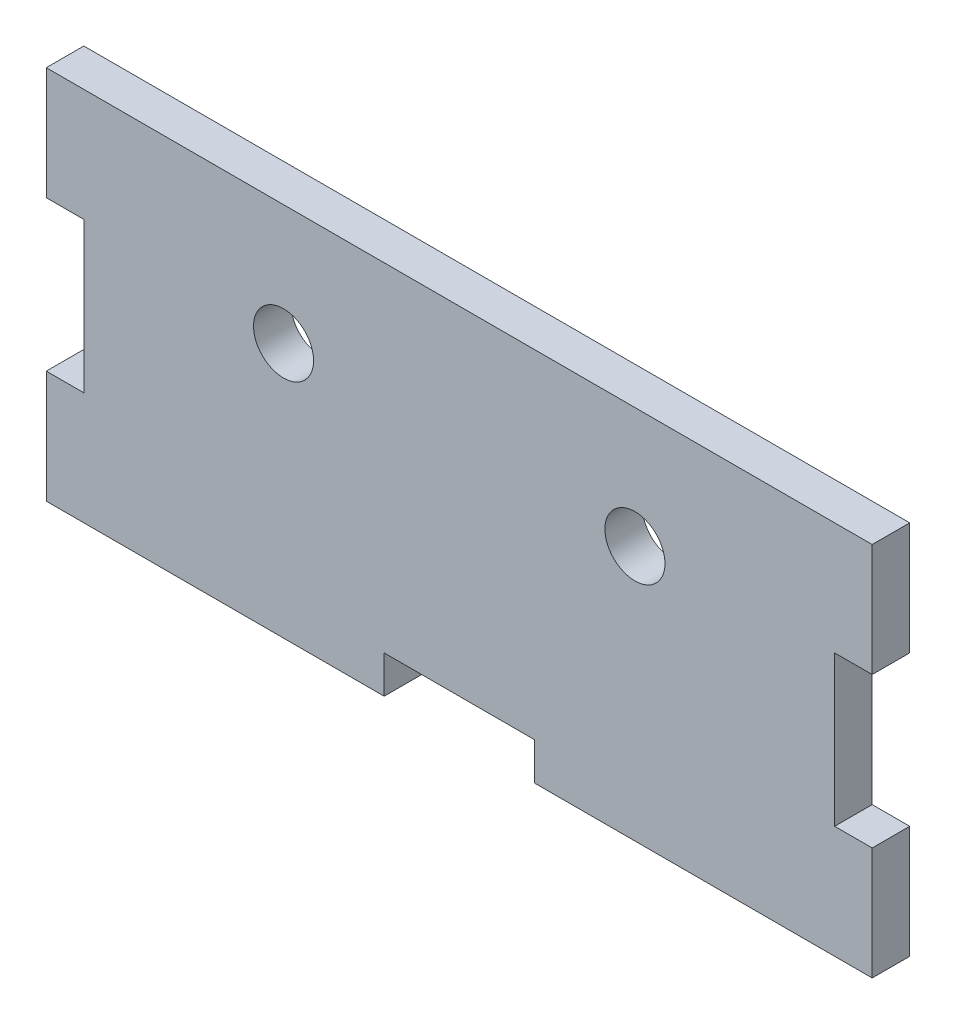
ISO-10303-21;
HEADER;
FILE_DESCRIPTION(('STEP AP214'),'2;1');
FILE_NAME('part.step','',(''),(''),'','','');
FILE_SCHEMA(('AUTOMOTIVE_DESIGN { 1 0 10303 214 1 1 1 1 }'));
ENDSEC;
DATA;
#1=APPLICATION_CONTEXT('core data for automotive mechanical design processes');
#2=APPLICATION_PROTOCOL_DEFINITION('international standard','automotive_design',2000,#1);
#3=PRODUCT_CONTEXT('',#1,'mechanical');
#4=PRODUCT('Part','Part','',(#3));
#5=PRODUCT_RELATED_PRODUCT_CATEGORY('part','',(#4));
#6=PRODUCT_DEFINITION_FORMATION('','',#4);
#7=PRODUCT_DEFINITION_CONTEXT('part definition',#1,'design');
#8=PRODUCT_DEFINITION('design','',#6,#7);
#9=PRODUCT_DEFINITION_SHAPE('','',#8);
#10=(LENGTH_UNIT() NAMED_UNIT(*) SI_UNIT(.MILLI.,.METRE.));
#11=(NAMED_UNIT(*) PLANE_ANGLE_UNIT() SI_UNIT($,.RADIAN.));
#12=(NAMED_UNIT(*) SI_UNIT($,.STERADIAN.) SOLID_ANGLE_UNIT());
#13=UNCERTAINTY_MEASURE_WITH_UNIT(LENGTH_MEASURE(1.E-05),#10,'distance_accuracy_value','');
#14=(GEOMETRIC_REPRESENTATION_CONTEXT(3) GLOBAL_UNCERTAINTY_ASSIGNED_CONTEXT((#13)) GLOBAL_UNIT_ASSIGNED_CONTEXT((#10,
#11,#12)) REPRESENTATION_CONTEXT('',''));
#15=CARTESIAN_POINT('',(0.,0.,0.));
#16=DIRECTION('',(0.,0.,1.));
#17=DIRECTION('',(1.,0.,0.));
#18=AXIS2_PLACEMENT_3D('',#15,#16,#17);
#19=CARTESIAN_POINT('',(0.,22.225,3.175));
#20=DIRECTION('',(0.,-1.,0.));
#21=DIRECTION('',(0.,0.,-1.));
#22=AXIS2_PLACEMENT_3D('',#19,#20,#21);
#23=PLANE('',#22);
#24=DIRECTION('',(-1.,0.,0.));
#25=VECTOR('',#24,1.);
#26=CARTESIAN_POINT('',(0.,22.225,0.));
#27=LINE('',#26,#25);
#28=CARTESIAN_POINT('',(69.85,22.225,0.));
#29=VERTEX_POINT('',#28);
#30=CARTESIAN_POINT('',(66.675,22.225,0.));
#31=VERTEX_POINT('',#30);
#32=EDGE_CURVE('E238',#29,#31,#27,.T.);
#33=ORIENTED_EDGE('',*,*,#32,.F.);
#34=DIRECTION('',(0.,0.,-1.));
#35=VECTOR('',#34,1.);
#36=CARTESIAN_POINT('',(69.85,22.225,3.175));
#37=LINE('',#36,#35);
#38=CARTESIAN_POINT('',(69.85,22.225,3.175));
#39=VERTEX_POINT('',#38);
#40=EDGE_CURVE('E11',#39,#29,#37,.T.);
#41=ORIENTED_EDGE('',*,*,#40,.F.);
#42=DIRECTION('',(-1.,0.,0.));
#43=VECTOR('',#42,1.);
#44=CARTESIAN_POINT('',(0.,22.225,3.175));
#45=LINE('',#44,#43);
#46=CARTESIAN_POINT('',(66.675,22.225,3.175));
#47=VERTEX_POINT('',#46);
#48=EDGE_CURVE('E499',#39,#47,#45,.T.);
#49=ORIENTED_EDGE('',*,*,#48,.T.);
#50=DIRECTION('',(0.,0.,-1.));
#51=VECTOR('',#50,1.);
#52=CARTESIAN_POINT('',(66.675,22.225,3.175));
#53=LINE('',#52,#51);
#54=EDGE_CURVE('E57',#47,#31,#53,.T.);
#55=ORIENTED_EDGE('',*,*,#54,.T.);
#56=EDGE_LOOP('',(#33,#41,#49,#55));
#57=FACE_BOUND('',#56,.T.);
#58=ADVANCED_FACE('F39',(#57),#23,.T.);
#59=CARTESIAN_POINT('',(69.85,0.,3.175));
#60=DIRECTION('',(-1.,0.,0.));
#61=DIRECTION('',(0.,0.,1.));
#62=AXIS2_PLACEMENT_3D('',#59,#60,#61);
#63=PLANE('',#62);
#64=DIRECTION('',(0.,1.,0.));
#65=VECTOR('',#64,1.);
#66=CARTESIAN_POINT('',(69.85,0.,0.));
#67=LINE('',#66,#65);
#68=CARTESIAN_POINT('',(69.85,31.75,0.));
#69=VERTEX_POINT('',#68);
#70=EDGE_CURVE('E234',#29,#69,#67,.T.);
#71=ORIENTED_EDGE('',*,*,#70,.T.);
#72=DIRECTION('',(0.,0.,-1.));
#73=VECTOR('',#72,1.);
#74=CARTESIAN_POINT('',(69.85,31.75,3.175));
#75=LINE('',#74,#73);
#76=CARTESIAN_POINT('',(69.85,31.75,3.175));
#77=VERTEX_POINT('',#76);
#78=EDGE_CURVE('E49',#77,#69,#75,.T.);
#79=ORIENTED_EDGE('',*,*,#78,.F.);
#80=DIRECTION('',(0.,1.,0.));
#81=VECTOR('',#80,1.);
#82=CARTESIAN_POINT('',(69.85,0.,3.175));
#83=LINE('',#82,#81);
#84=EDGE_CURVE('E177',#39,#77,#83,.T.);
#85=ORIENTED_EDGE('',*,*,#84,.F.);
#86=ORIENTED_EDGE('',*,*,#40,.T.);
#87=EDGE_LOOP('',(#71,#79,#85,#86));
#88=FACE_BOUND('',#87,.T.);
#89=ADVANCED_FACE('F235',(#88),#63,.F.);
#90=CARTESIAN_POINT('',(0.,31.75,3.175));
#91=DIRECTION('',(0.,1.,0.));
#92=DIRECTION('',(0.,0.,1.));
#93=AXIS2_PLACEMENT_3D('',#90,#91,#92);
#94=PLANE('',#93);
#95=DIRECTION('',(1.,0.,0.));
#96=VECTOR('',#95,1.);
#97=CARTESIAN_POINT('',(0.,31.75,0.));
#98=LINE('',#97,#96);
#99=CARTESIAN_POINT('',(0.,31.75,0.));
#100=VERTEX_POINT('',#99);
#101=EDGE_CURVE('E228',#100,#69,#98,.T.);
#102=ORIENTED_EDGE('',*,*,#101,.F.);
#103=DIRECTION('',(0.,0.,-1.));
#104=VECTOR('',#103,1.);
#105=CARTESIAN_POINT('',(0.,31.75,3.175));
#106=LINE('',#105,#104);
#107=CARTESIAN_POINT('',(0.,31.75,3.175));
#108=VERTEX_POINT('',#107);
#109=EDGE_CURVE('E218',#108,#100,#106,.T.);
#110=ORIENTED_EDGE('',*,*,#109,.F.);
#111=DIRECTION('',(1.,0.,0.));
#112=VECTOR('',#111,1.);
#113=CARTESIAN_POINT('',(0.,31.75,3.175));
#114=LINE('',#113,#112);
#115=EDGE_CURVE('E231',#108,#77,#114,.T.);
#116=ORIENTED_EDGE('',*,*,#115,.T.);
#117=ORIENTED_EDGE('',*,*,#78,.T.);
#118=EDGE_LOOP('',(#102,#110,#116,#117));
#119=FACE_BOUND('',#118,.T.);
#120=ADVANCED_FACE('F226',(#119),#94,.T.);
#121=CARTESIAN_POINT('',(0.,0.,3.175));
#122=DIRECTION('',(-1.,0.,0.));
#123=DIRECTION('',(0.,0.,1.));
#124=AXIS2_PLACEMENT_3D('',#121,#122,#123);
#125=PLANE('',#124);
#126=DIRECTION('',(0.,1.,0.));
#127=VECTOR('',#126,1.);
#128=CARTESIAN_POINT('',(0.,0.,0.));
#129=LINE('',#128,#127);
#130=CARTESIAN_POINT('',(0.,22.225,0.));
#131=VERTEX_POINT('',#130);
#132=EDGE_CURVE('E243',#131,#100,#129,.T.);
#133=ORIENTED_EDGE('',*,*,#132,.F.);
#134=DIRECTION('',(0.,0.,-1.));
#135=VECTOR('',#134,1.);
#136=CARTESIAN_POINT('',(0.,22.225,3.175));
#137=LINE('',#136,#135);
#138=CARTESIAN_POINT('',(0.,22.225,3.175));
#139=VERTEX_POINT('',#138);
#140=EDGE_CURVE('E215',#139,#131,#137,.T.);
#141=ORIENTED_EDGE('',*,*,#140,.F.);
#142=DIRECTION('',(0.,1.,0.));
#143=VECTOR('',#142,1.);
#144=CARTESIAN_POINT('',(0.,0.,3.175));
#145=LINE('',#144,#143);
#146=EDGE_CURVE('E490',#139,#108,#145,.T.);
#147=ORIENTED_EDGE('',*,*,#146,.T.);
#148=ORIENTED_EDGE('',*,*,#109,.T.);
#149=EDGE_LOOP('',(#133,#141,#147,#148));
#150=FACE_BOUND('',#149,.T.);
#151=ADVANCED_FACE('F431',(#150),#125,.T.);
#152=CARTESIAN_POINT('',(0.,22.225,3.175));
#153=DIRECTION('',(0.,1.,0.));
#154=DIRECTION('',(0.,0.,1.));
#155=AXIS2_PLACEMENT_3D('',#152,#153,#154);
#156=PLANE('',#155);
#157=DIRECTION('',(1.,0.,0.));
#158=VECTOR('',#157,1.);
#159=CARTESIAN_POINT('',(0.,22.225,0.));
#160=LINE('',#159,#158);
#161=CARTESIAN_POINT('',(3.175,22.225,0.));
#162=VERTEX_POINT('',#161);
#163=EDGE_CURVE('E247',#131,#162,#160,.T.);
#164=ORIENTED_EDGE('',*,*,#163,.T.);
#165=DIRECTION('',(0.,0.,-1.));
#166=VECTOR('',#165,1.);
#167=CARTESIAN_POINT('',(3.175,22.225,3.175));
#168=LINE('',#167,#166);
#169=CARTESIAN_POINT('',(3.175,22.225,3.175));
#170=VERTEX_POINT('',#169);
#171=EDGE_CURVE('E211',#170,#162,#168,.T.);
#172=ORIENTED_EDGE('',*,*,#171,.F.);
#173=DIRECTION('',(1.,0.,0.));
#174=VECTOR('',#173,1.);
#175=CARTESIAN_POINT('',(0.,22.225,3.175));
#176=LINE('',#175,#174);
#177=EDGE_CURVE('E496',#139,#170,#176,.T.);
#178=ORIENTED_EDGE('',*,*,#177,.F.);
#179=ORIENTED_EDGE('',*,*,#140,.T.);
#180=EDGE_LOOP('',(#164,#172,#178,#179));
#181=FACE_BOUND('',#180,.T.);
#182=ADVANCED_FACE('F449',(#181),#156,.F.);
#183=CARTESIAN_POINT('',(3.175,0.,3.175));
#184=DIRECTION('',(1.,0.,0.));
#185=DIRECTION('',(0.,0.,-1.));
#186=AXIS2_PLACEMENT_3D('',#183,#184,#185);
#187=PLANE('',#186);
#188=DIRECTION('',(0.,-1.,0.));
#189=VECTOR('',#188,1.);
#190=CARTESIAN_POINT('',(3.175,0.,0.));
#191=LINE('',#190,#189);
#192=CARTESIAN_POINT('',(3.175,9.525,0.));
#193=VERTEX_POINT('',#192);
#194=EDGE_CURVE('E255',#162,#193,#191,.T.);
#195=ORIENTED_EDGE('',*,*,#194,.T.);
#196=DIRECTION('',(0.,0.,-1.));
#197=VECTOR('',#196,1.);
#198=CARTESIAN_POINT('',(3.175,9.525,3.175));
#199=LINE('',#198,#197);
#200=CARTESIAN_POINT('',(3.175,9.525,3.175));
#201=VERTEX_POINT('',#200);
#202=EDGE_CURVE('E208',#201,#193,#199,.T.);
#203=ORIENTED_EDGE('',*,*,#202,.F.);
#204=DIRECTION('',(0.,-1.,0.));
#205=VECTOR('',#204,1.);
#206=CARTESIAN_POINT('',(3.175,0.,3.175));
#207=LINE('',#206,#205);
#208=EDGE_CURVE('E504',#170,#201,#207,.T.);
#209=ORIENTED_EDGE('',*,*,#208,.F.);
#210=ORIENTED_EDGE('',*,*,#171,.T.);
#211=EDGE_LOOP('',(#195,#203,#209,#210));
#212=FACE_BOUND('',#211,.T.);
#213=ADVANCED_FACE('F439',(#212),#187,.F.);
#214=CARTESIAN_POINT('',(0.,9.525,3.175));
#215=DIRECTION('',(0.,1.,0.));
#216=DIRECTION('',(0.,0.,1.));
#217=AXIS2_PLACEMENT_3D('',#214,#215,#216);
#218=PLANE('',#217);
#219=DIRECTION('',(1.,0.,0.));
#220=VECTOR('',#219,1.);
#221=CARTESIAN_POINT('',(0.,9.525,0.));
#222=LINE('',#221,#220);
#223=CARTESIAN_POINT('',(0.,9.525,0.));
#224=VERTEX_POINT('',#223);
#225=EDGE_CURVE('E259',#224,#193,#222,.T.);
#226=ORIENTED_EDGE('',*,*,#225,.F.);
#227=DIRECTION('',(0.,0.,-1.));
#228=VECTOR('',#227,1.);
#229=CARTESIAN_POINT('',(0.,9.525,3.175));
#230=LINE('',#229,#228);
#231=CARTESIAN_POINT('',(0.,9.525,3.175));
#232=VERTEX_POINT('',#231);
#233=EDGE_CURVE('E205',#232,#224,#230,.T.);
#234=ORIENTED_EDGE('',*,*,#233,.F.);
#235=DIRECTION('',(1.,0.,0.));
#236=VECTOR('',#235,1.);
#237=CARTESIAN_POINT('',(0.,9.525,3.175));
#238=LINE('',#237,#236);
#239=EDGE_CURVE('E507',#232,#201,#238,.T.);
#240=ORIENTED_EDGE('',*,*,#239,.T.);
#241=ORIENTED_EDGE('',*,*,#202,.T.);
#242=EDGE_LOOP('',(#226,#234,#240,#241));
#243=FACE_BOUND('',#242,.T.);
#244=ADVANCED_FACE('F428',(#243),#218,.T.);
#245=CARTESIAN_POINT('',(0.,0.,0.));
#246=VERTEX_POINT('',#245);
#247=EDGE_CURVE('E249',#246,#224,#129,.T.);
#248=ORIENTED_EDGE('',*,*,#247,.F.);
#249=DIRECTION('',(0.,0.,-1.));
#250=VECTOR('',#249,1.);
#251=CARTESIAN_POINT('',(0.,0.,3.175));
#252=LINE('',#251,#250);
#253=CARTESIAN_POINT('',(0.,0.,3.175));
#254=VERTEX_POINT('',#253);
#255=EDGE_CURVE('E202',#254,#246,#252,.T.);
#256=ORIENTED_EDGE('',*,*,#255,.F.);
#257=EDGE_CURVE('E498',#254,#232,#145,.T.);
#258=ORIENTED_EDGE('',*,*,#257,.T.);
#259=ORIENTED_EDGE('',*,*,#233,.T.);
#260=EDGE_LOOP('',(#248,#256,#258,#259));
#261=FACE_BOUND('',#260,.T.);
#262=ADVANCED_FACE('F419',(#261),#125,.T.);
#263=CARTESIAN_POINT('',(0.,0.,3.175));
#264=DIRECTION('',(0.,1.,0.));
#265=DIRECTION('',(0.,0.,1.));
#266=AXIS2_PLACEMENT_3D('',#263,#264,#265);
#267=PLANE('',#266);
#268=DIRECTION('',(1.,0.,0.));
#269=VECTOR('',#268,1.);
#270=CARTESIAN_POINT('',(0.,0.,0.));
#271=LINE('',#270,#269);
#272=CARTESIAN_POINT('',(28.575,0.,0.));
#273=VERTEX_POINT('',#272);
#274=EDGE_CURVE('E263',#246,#273,#271,.T.);
#275=ORIENTED_EDGE('',*,*,#274,.T.);
#276=DIRECTION('',(0.,0.,-1.));
#277=VECTOR('',#276,1.);
#278=CARTESIAN_POINT('',(28.575,0.,3.175));
#279=LINE('',#278,#277);
#280=CARTESIAN_POINT('',(28.575,0.,3.175));
#281=VERTEX_POINT('',#280);
#282=EDGE_CURVE('E199',#281,#273,#279,.T.);
#283=ORIENTED_EDGE('',*,*,#282,.F.);
#284=DIRECTION('',(1.,0.,0.));
#285=VECTOR('',#284,1.);
#286=CARTESIAN_POINT('',(0.,0.,3.175));
#287=LINE('',#286,#285);
#288=EDGE_CURVE('E511',#254,#281,#287,.T.);
#289=ORIENTED_EDGE('',*,*,#288,.F.);
#290=ORIENTED_EDGE('',*,*,#255,.T.);
#291=EDGE_LOOP('',(#275,#283,#289,#290));
#292=FACE_BOUND('',#291,.T.);
#293=ADVANCED_FACE('F382',(#292),#267,.F.);
#294=CARTESIAN_POINT('',(28.575,0.,3.175));
#295=DIRECTION('',(1.,0.,0.));
#296=DIRECTION('',(0.,0.,-1.));
#297=AXIS2_PLACEMENT_3D('',#294,#295,#296);
#298=PLANE('',#297);
#299=DIRECTION('',(0.,-1.,0.));
#300=VECTOR('',#299,1.);
#301=CARTESIAN_POINT('',(28.575,0.,0.));
#302=LINE('',#301,#300);
#303=CARTESIAN_POINT('',(28.575,3.175,0.));
#304=VERTEX_POINT('',#303);
#305=EDGE_CURVE('E267',#304,#273,#302,.T.);
#306=ORIENTED_EDGE('',*,*,#305,.F.);
#307=DIRECTION('',(0.,0.,-1.));
#308=VECTOR('',#307,1.);
#309=CARTESIAN_POINT('',(28.575,3.175,3.175));
#310=LINE('',#309,#308);
#311=CARTESIAN_POINT('',(28.575,3.175,3.175));
#312=VERTEX_POINT('',#311);
#313=EDGE_CURVE('E196',#312,#304,#310,.T.);
#314=ORIENTED_EDGE('',*,*,#313,.F.);
#315=DIRECTION('',(0.,-1.,0.));
#316=VECTOR('',#315,1.);
#317=CARTESIAN_POINT('',(28.575,0.,3.175));
#318=LINE('',#317,#316);
#319=EDGE_CURVE('E514',#312,#281,#318,.T.);
#320=ORIENTED_EDGE('',*,*,#319,.T.);
#321=ORIENTED_EDGE('',*,*,#282,.T.);
#322=EDGE_LOOP('',(#306,#314,#320,#321));
#323=FACE_BOUND('',#322,.T.);
#324=ADVANCED_FACE('F400',(#323),#298,.T.);
#325=CARTESIAN_POINT('',(0.,3.175,3.175));
#326=DIRECTION('',(0.,-1.,0.));
#327=DIRECTION('',(0.,0.,-1.));
#328=AXIS2_PLACEMENT_3D('',#325,#326,#327);
#329=PLANE('',#328);
#330=DIRECTION('',(-1.,0.,0.));
#331=VECTOR('',#330,1.);
#332=CARTESIAN_POINT('',(0.,3.175,0.));
#333=LINE('',#332,#331);
#334=CARTESIAN_POINT('',(41.275,3.175,0.));
#335=VERTEX_POINT('',#334);
#336=EDGE_CURVE('E272',#335,#304,#333,.T.);
#337=ORIENTED_EDGE('',*,*,#336,.F.);
#338=DIRECTION('',(0.,0.,-1.));
#339=VECTOR('',#338,1.);
#340=CARTESIAN_POINT('',(41.275,3.175,3.175));
#341=LINE('',#340,#339);
#342=CARTESIAN_POINT('',(41.275,3.175,3.175));
#343=VERTEX_POINT('',#342);
#344=EDGE_CURVE('E193',#343,#335,#341,.T.);
#345=ORIENTED_EDGE('',*,*,#344,.F.);
#346=DIRECTION('',(-1.,0.,0.));
#347=VECTOR('',#346,1.);
#348=CARTESIAN_POINT('',(0.,3.175,3.175));
#349=LINE('',#348,#347);
#350=EDGE_CURVE('E518',#343,#312,#349,.T.);
#351=ORIENTED_EDGE('',*,*,#350,.T.);
#352=ORIENTED_EDGE('',*,*,#313,.T.);
#353=EDGE_LOOP('',(#337,#345,#351,#352));
#354=FACE_BOUND('',#353,.T.);
#355=ADVANCED_FACE('F390',(#354),#329,.T.);
#356=CARTESIAN_POINT('',(41.275,0.,3.175));
#357=DIRECTION('',(1.,0.,0.));
#358=DIRECTION('',(0.,0.,-1.));
#359=AXIS2_PLACEMENT_3D('',#356,#357,#358);
#360=PLANE('',#359);
#361=DIRECTION('',(0.,-1.,0.));
#362=VECTOR('',#361,1.);
#363=CARTESIAN_POINT('',(41.275,0.,0.));
#364=LINE('',#363,#362);
#365=CARTESIAN_POINT('',(41.275,0.,0.));
#366=VERTEX_POINT('',#365);
#367=EDGE_CURVE('E276',#335,#366,#364,.T.);
#368=ORIENTED_EDGE('',*,*,#367,.T.);
#369=DIRECTION('',(0.,0.,-1.));
#370=VECTOR('',#369,1.);
#371=CARTESIAN_POINT('',(41.275,0.,3.175));
#372=LINE('',#371,#370);
#373=CARTESIAN_POINT('',(41.275,0.,3.175));
#374=VERTEX_POINT('',#373);
#375=EDGE_CURVE('E185',#374,#366,#372,.T.);
#376=ORIENTED_EDGE('',*,*,#375,.F.);
#377=DIRECTION('',(0.,-1.,0.));
#378=VECTOR('',#377,1.);
#379=CARTESIAN_POINT('',(41.275,0.,3.175));
#380=LINE('',#379,#378);
#381=EDGE_CURVE('E521',#343,#374,#380,.T.);
#382=ORIENTED_EDGE('',*,*,#381,.F.);
#383=ORIENTED_EDGE('',*,*,#344,.T.);
#384=EDGE_LOOP('',(#368,#376,#382,#383));
#385=FACE_BOUND('',#384,.T.);
#386=ADVANCED_FACE('F379',(#385),#360,.F.);
#387=CARTESIAN_POINT('',(69.85,0.,0.));
#388=VERTEX_POINT('',#387);
#389=EDGE_CURVE('E268',#366,#388,#271,.T.);
#390=ORIENTED_EDGE('',*,*,#389,.T.);
#391=DIRECTION('',(0.,0.,-1.));
#392=VECTOR('',#391,1.);
#393=CARTESIAN_POINT('',(69.85,0.,3.175));
#394=LINE('',#393,#392);
#395=CARTESIAN_POINT('',(69.85,0.,3.175));
#396=VERTEX_POINT('',#395);
#397=EDGE_CURVE('E181',#396,#388,#394,.T.);
#398=ORIENTED_EDGE('',*,*,#397,.F.);
#399=EDGE_CURVE('E171',#374,#396,#287,.T.);
#400=ORIENTED_EDGE('',*,*,#399,.F.);
#401=ORIENTED_EDGE('',*,*,#375,.T.);
#402=EDGE_LOOP('',(#390,#398,#400,#401));
#403=FACE_BOUND('',#402,.T.);
#404=ADVANCED_FACE('F371',(#403),#267,.F.);
#405=CARTESIAN_POINT('',(69.85,9.525,0.));
#406=VERTEX_POINT('',#405);
#407=EDGE_CURVE('E179',#388,#406,#67,.T.);
#408=ORIENTED_EDGE('',*,*,#407,.T.);
#409=DIRECTION('',(0.,0.,-1.));
#410=VECTOR('',#409,1.);
#411=CARTESIAN_POINT('',(69.85,9.525,3.175));
#412=LINE('',#411,#410);
#413=CARTESIAN_POINT('',(69.85,9.525,3.175));
#414=VERTEX_POINT('',#413);
#415=EDGE_CURVE('E159',#414,#406,#412,.T.);
#416=ORIENTED_EDGE('',*,*,#415,.F.);
#417=EDGE_CURVE('E165',#396,#414,#83,.T.);
#418=ORIENTED_EDGE('',*,*,#417,.F.);
#419=ORIENTED_EDGE('',*,*,#397,.T.);
#420=EDGE_LOOP('',(#408,#416,#418,#419));
#421=FACE_BOUND('',#420,.T.);
#422=ADVANCED_FACE('F178',(#421),#63,.F.);
#423=CARTESIAN_POINT('',(0.,9.525,3.175));
#424=DIRECTION('',(0.,-1.,0.));
#425=DIRECTION('',(0.,0.,-1.));
#426=AXIS2_PLACEMENT_3D('',#423,#424,#425);
#427=PLANE('',#426);
#428=DIRECTION('',(-1.,0.,0.));
#429=VECTOR('',#428,1.);
#430=CARTESIAN_POINT('',(0.,9.525,0.));
#431=LINE('',#430,#429);
#432=CARTESIAN_POINT('',(66.675,9.525,0.));
#433=VERTEX_POINT('',#432);
#434=EDGE_CURVE('E280',#406,#433,#431,.T.);
#435=ORIENTED_EDGE('',*,*,#434,.T.);
#436=DIRECTION('',(0.,0.,-1.));
#437=VECTOR('',#436,1.);
#438=CARTESIAN_POINT('',(66.675,9.525,3.175));
#439=LINE('',#438,#437);
#440=CARTESIAN_POINT('',(66.675,9.525,3.175));
#441=VERTEX_POINT('',#440);
#442=EDGE_CURVE('E107',#441,#433,#439,.T.);
#443=ORIENTED_EDGE('',*,*,#442,.F.);
#444=DIRECTION('',(-1.,0.,0.));
#445=VECTOR('',#444,1.);
#446=CARTESIAN_POINT('',(0.,9.525,3.175));
#447=LINE('',#446,#445);
#448=EDGE_CURVE('E155',#414,#441,#447,.T.);
#449=ORIENTED_EDGE('',*,*,#448,.F.);
#450=ORIENTED_EDGE('',*,*,#415,.T.);
#451=EDGE_LOOP('',(#435,#443,#449,#450));
#452=FACE_BOUND('',#451,.T.);
#453=ADVANCED_FACE('F157',(#452),#427,.F.);
#454=CARTESIAN_POINT('',(20.066,21.59,3.175));
#455=DIRECTION('',(0.,0.,-1.));
#456=DIRECTION('',(-1.,0.,0.));
#457=AXIS2_PLACEMENT_3D('',#454,#455,#456);
#458=CYLINDRICAL_SURFACE('',#457,2.54);
#459=CARTESIAN_POINT('',(20.066,21.59,3.175));
#460=DIRECTION('',(0.,0.,1.));
#461=DIRECTION('',(1.,0.,0.));
#462=AXIS2_PLACEMENT_3D('',#459,#460,#461);
#463=CIRCLE('',#462,2.54);
#464=CARTESIAN_POINT('',(22.606,21.59,3.175));
#465=VERTEX_POINT('',#464);
#466=EDGE_CURVE('E329',#465,#465,#463,.T.);
#467=ORIENTED_EDGE('',*,*,#466,.T.);
#468=EDGE_LOOP('',(#467));
#469=FACE_BOUND('',#468,.T.);
#470=CARTESIAN_POINT('',(20.066,21.59,0.));
#471=DIRECTION('',(0.,0.,1.));
#472=DIRECTION('',(1.,0.,0.));
#473=AXIS2_PLACEMENT_3D('',#470,#471,#472);
#474=CIRCLE('',#473,2.54);
#475=CARTESIAN_POINT('',(22.606,21.59,0.));
#476=VERTEX_POINT('',#475);
#477=EDGE_CURVE('E296',#476,#476,#474,.T.);
#478=ORIENTED_EDGE('',*,*,#477,.F.);
#479=EDGE_LOOP('',(#478));
#480=FACE_BOUND('',#479,.T.);
#481=ADVANCED_FACE('F309',(#469,#480),#458,.F.);
#482=CARTESIAN_POINT('',(49.784,21.59,3.175));
#483=DIRECTION('',(0.,0.,-1.));
#484=DIRECTION('',(-1.,0.,0.));
#485=AXIS2_PLACEMENT_3D('',#482,#483,#484);
#486=CYLINDRICAL_SURFACE('',#485,2.54);
#487=CARTESIAN_POINT('',(49.784,21.59,3.175));
#488=DIRECTION('',(0.,0.,1.));
#489=DIRECTION('',(1.,0.,0.));
#490=AXIS2_PLACEMENT_3D('',#487,#488,#489);
#491=CIRCLE('',#490,2.54);
#492=CARTESIAN_POINT('',(52.324,21.59,3.175));
#493=VERTEX_POINT('',#492);
#494=EDGE_CURVE('E286',#493,#493,#491,.T.);
#495=ORIENTED_EDGE('',*,*,#494,.T.);
#496=EDGE_LOOP('',(#495));
#497=FACE_BOUND('',#496,.T.);
#498=CARTESIAN_POINT('',(49.784,21.59,0.));
#499=DIRECTION('',(0.,0.,1.));
#500=DIRECTION('',(1.,0.,0.));
#501=AXIS2_PLACEMENT_3D('',#498,#499,#500);
#502=CIRCLE('',#501,2.54);
#503=CARTESIAN_POINT('',(52.324,21.59,0.));
#504=VERTEX_POINT('',#503);
#505=EDGE_CURVE('E292',#504,#504,#502,.T.);
#506=ORIENTED_EDGE('',*,*,#505,.F.);
#507=EDGE_LOOP('',(#506));
#508=FACE_BOUND('',#507,.T.);
#509=ADVANCED_FACE('F41',(#497,#508),#486,.F.);
#510=CARTESIAN_POINT('',(66.675,0.,3.175));
#511=DIRECTION('',(1.,0.,0.));
#512=DIRECTION('',(0.,0.,-1.));
#513=AXIS2_PLACEMENT_3D('',#510,#511,#512);
#514=PLANE('',#513);
#515=DIRECTION('',(0.,-1.,0.));
#516=VECTOR('',#515,1.);
#517=CARTESIAN_POINT('',(66.675,0.,0.));
#518=LINE('',#517,#516);
#519=EDGE_CURVE('E283',#31,#433,#518,.T.);
#520=ORIENTED_EDGE('',*,*,#519,.F.);
#521=ORIENTED_EDGE('',*,*,#54,.F.);
#522=DIRECTION('',(0.,-1.,0.));
#523=VECTOR('',#522,1.);
#524=CARTESIAN_POINT('',(66.675,0.,3.175));
#525=LINE('',#524,#523);
#526=EDGE_CURVE('E164',#47,#441,#525,.T.);
#527=ORIENTED_EDGE('',*,*,#526,.T.);
#528=ORIENTED_EDGE('',*,*,#442,.T.);
#529=EDGE_LOOP('',(#520,#521,#527,#528));
#530=FACE_BOUND('',#529,.T.);
#531=ADVANCED_FACE('F300',(#530),#514,.T.);
#532=CARTESIAN_POINT('',(0.,0.,3.175));
#533=DIRECTION('',(0.,0.,1.));
#534=DIRECTION('',(1.,0.,0.));
#535=AXIS2_PLACEMENT_3D('',#532,#533,#534);
#536=PLANE('',#535);
#537=ORIENTED_EDGE('',*,*,#494,.F.);
#538=EDGE_LOOP('',(#537));
#539=FACE_BOUND('',#538,.T.);
#540=ORIENTED_EDGE('',*,*,#466,.F.);
#541=EDGE_LOOP('',(#540));
#542=FACE_BOUND('',#541,.T.);
#543=ORIENTED_EDGE('',*,*,#48,.F.);
#544=ORIENTED_EDGE('',*,*,#84,.T.);
#545=ORIENTED_EDGE('',*,*,#115,.F.);
#546=ORIENTED_EDGE('',*,*,#146,.F.);
#547=ORIENTED_EDGE('',*,*,#177,.T.);
#548=ORIENTED_EDGE('',*,*,#208,.T.);
#549=ORIENTED_EDGE('',*,*,#239,.F.);
#550=ORIENTED_EDGE('',*,*,#257,.F.);
#551=ORIENTED_EDGE('',*,*,#288,.T.);
#552=ORIENTED_EDGE('',*,*,#319,.F.);
#553=ORIENTED_EDGE('',*,*,#350,.F.);
#554=ORIENTED_EDGE('',*,*,#381,.T.);
#555=ORIENTED_EDGE('',*,*,#399,.T.);
#556=ORIENTED_EDGE('',*,*,#417,.T.);
#557=ORIENTED_EDGE('',*,*,#448,.T.);
#558=ORIENTED_EDGE('',*,*,#526,.F.);
#559=EDGE_LOOP('',(#543,#544,#545,#546,#547,#548,#549,#550,#551,#552,#553,#554,#555,#556,#557,#558));
#560=FACE_BOUND('',#559,.T.);
#561=ADVANCED_FACE('F169',(#539,#542,#560),#536,.T.);
#562=CARTESIAN_POINT('',(0.,0.,0.));
#563=DIRECTION('',(0.,0.,1.));
#564=DIRECTION('',(1.,0.,0.));
#565=AXIS2_PLACEMENT_3D('',#562,#563,#564);
#566=PLANE('',#565);
#567=ORIENTED_EDGE('',*,*,#505,.T.);
#568=EDGE_LOOP('',(#567));
#569=FACE_BOUND('',#568,.T.);
#570=ORIENTED_EDGE('',*,*,#477,.T.);
#571=EDGE_LOOP('',(#570));
#572=FACE_BOUND('',#571,.T.);
#573=ORIENTED_EDGE('',*,*,#32,.T.);
#574=ORIENTED_EDGE('',*,*,#519,.T.);
#575=ORIENTED_EDGE('',*,*,#434,.F.);
#576=ORIENTED_EDGE('',*,*,#407,.F.);
#577=ORIENTED_EDGE('',*,*,#389,.F.);
#578=ORIENTED_EDGE('',*,*,#367,.F.);
#579=ORIENTED_EDGE('',*,*,#336,.T.);
#580=ORIENTED_EDGE('',*,*,#305,.T.);
#581=ORIENTED_EDGE('',*,*,#274,.F.);
#582=ORIENTED_EDGE('',*,*,#247,.T.);
#583=ORIENTED_EDGE('',*,*,#225,.T.);
#584=ORIENTED_EDGE('',*,*,#194,.F.);
#585=ORIENTED_EDGE('',*,*,#163,.F.);
#586=ORIENTED_EDGE('',*,*,#132,.T.);
#587=ORIENTED_EDGE('',*,*,#101,.T.);
#588=ORIENTED_EDGE('',*,*,#70,.F.);
#589=EDGE_LOOP('',(#573,#574,#575,#576,#577,#578,#579,#580,#581,#582,#583,#584,#585,#586,#587,#588));
#590=FACE_BOUND('',#589,.T.);
#591=ADVANCED_FACE('F240',(#569,#572,#590),#566,.F.);
#592=CLOSED_SHELL('',(#58,#89,#120,#151,#182,#213,#244,#262,#293,#324,#355,#386,#404,#422,#453,
#481,#509,#531,#561,#591));
#593=MANIFOLD_SOLID_BREP('B2',#592);
#594=ADVANCED_BREP_SHAPE_REPRESENTATION('',(#18,#593),#14);
#595=SHAPE_DEFINITION_REPRESENTATION(#9,#594);
ENDSEC;
END-ISO-10303-21;
